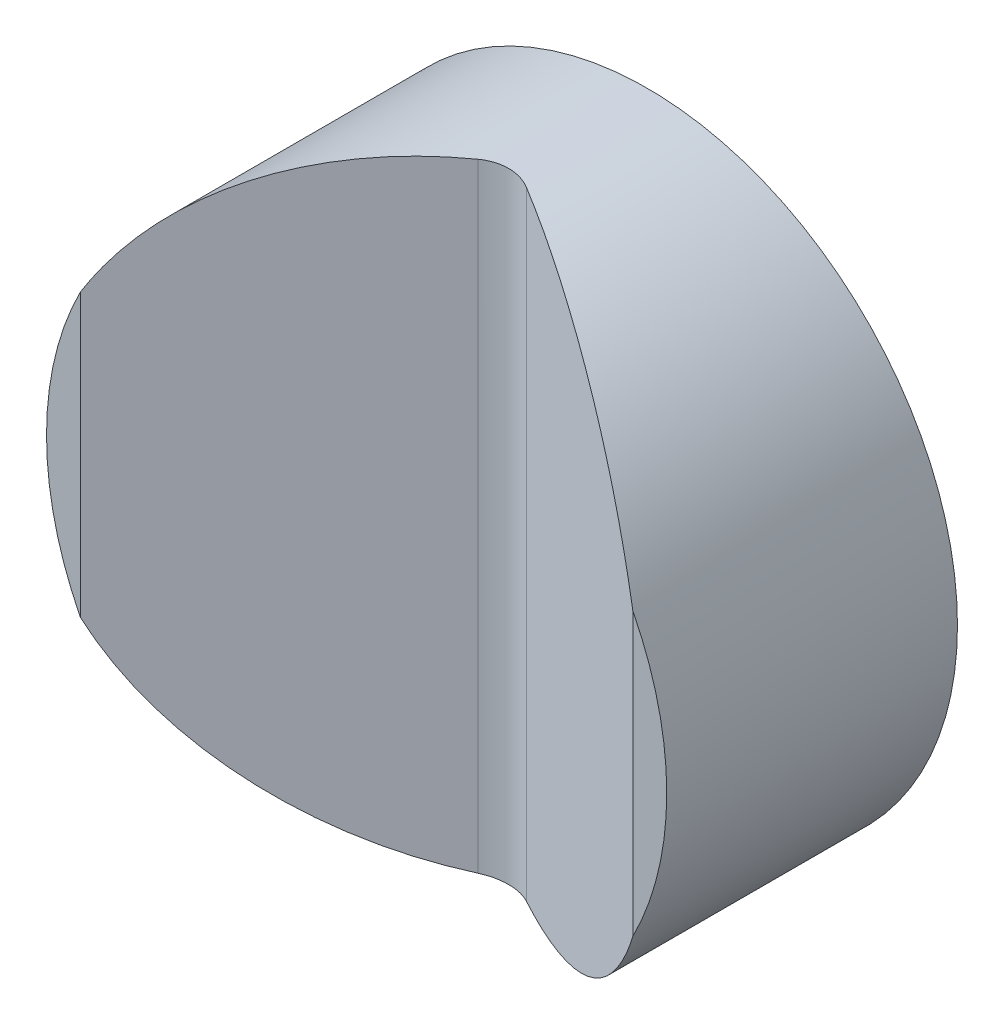
ISO-10303-21;
HEADER;
FILE_DESCRIPTION(('STEP AP214'),'2;1');
FILE_NAME('part.step','',(''),(''),'','','');
FILE_SCHEMA(('AUTOMOTIVE_DESIGN { 1 0 10303 214 1 1 1 1 }'));
ENDSEC;
DATA;
#1=APPLICATION_CONTEXT('core data for automotive mechanical design processes');
#2=APPLICATION_PROTOCOL_DEFINITION('international standard','automotive_design',2000,#1);
#3=PRODUCT_CONTEXT('',#1,'mechanical');
#4=PRODUCT('Part','Part','',(#3));
#5=PRODUCT_RELATED_PRODUCT_CATEGORY('part','',(#4));
#6=PRODUCT_DEFINITION_FORMATION('','',#4);
#7=PRODUCT_DEFINITION_CONTEXT('part definition',#1,'design');
#8=PRODUCT_DEFINITION('design','',#6,#7);
#9=PRODUCT_DEFINITION_SHAPE('','',#8);
#10=(LENGTH_UNIT() NAMED_UNIT(*) SI_UNIT(.MILLI.,.METRE.));
#11=(NAMED_UNIT(*) PLANE_ANGLE_UNIT() SI_UNIT($,.RADIAN.));
#12=(NAMED_UNIT(*) SI_UNIT($,.STERADIAN.) SOLID_ANGLE_UNIT());
#13=UNCERTAINTY_MEASURE_WITH_UNIT(LENGTH_MEASURE(1.E-05),#10,'distance_accuracy_value','');
#14=(GEOMETRIC_REPRESENTATION_CONTEXT(3) GLOBAL_UNCERTAINTY_ASSIGNED_CONTEXT((#13)) GLOBAL_UNIT_ASSIGNED_CONTEXT((#10,
#11,#12)) REPRESENTATION_CONTEXT('',''));
#15=CARTESIAN_POINT('',(0.,0.,0.));
#16=DIRECTION('',(0.,0.,1.));
#17=DIRECTION('',(1.,0.,0.));
#18=AXIS2_PLACEMENT_3D('',#15,#16,#17);
#19=CARTESIAN_POINT('',(0.,0.,-8.));
#20=DIRECTION('',(0.,0.,1.));
#21=DIRECTION('',(1.,0.,0.));
#22=AXIS2_PLACEMENT_3D('',#19,#20,#21);
#23=CYLINDRICAL_SURFACE('',#22,32.);
#24=CARTESIAN_POINT('',(0.,0.,0.));
#25=DIRECTION('',(0.,0.,1.));
#26=DIRECTION('',(1.,0.,0.));
#27=AXIS2_PLACEMENT_3D('',#24,#25,#26);
#28=CIRCLE('',#27,32.);
#29=CARTESIAN_POINT('',(32.,0.,0.));
#30=VERTEX_POINT('',#29);
#31=EDGE_CURVE('E99',#30,#30,#28,.T.);
#32=ORIENTED_EDGE('',*,*,#31,.T.);
#33=EDGE_LOOP('',(#32));
#34=FACE_BOUND('',#33,.T.);
#35=CARTESIAN_POINT('',(0.,0.,13.5455173280956));
#36=DIRECTION('',(0.500000000000001,0.,0.866025403784438));
#37=DIRECTION('',(-0.866025403784438,0.,0.500000000000001));
#38=AXIS2_PLACEMENT_3D('',#35,#36,#37);
#39=ELLIPSE('',#38,36.9504172281361,32.);
#40=CARTESIAN_POINT('',(-2.5,31.9021942818985,14.9888930010697));
#41=VERTEX_POINT('',#40);
#42=CARTESIAN_POINT('',(-28.5,14.5516322108552,30.));
#43=VERTEX_POINT('',#42);
#44=EDGE_CURVE('E63',#41,#43,#39,.T.);
#45=ORIENTED_EDGE('',*,*,#44,.F.);
#46=CARTESIAN_POINT('',(2.50000000000001,31.9021942818985,14.9888930010697));
#47=CARTESIAN_POINT('',(2.37929948328451,31.9116591797357,14.9191897750718));
#48=CARTESIAN_POINT('',(2.25564211743912,31.9206543995909,14.8545420297625));
#49=CARTESIAN_POINT('',(2.00329663766707,31.937480874513,14.7357667653459));
#50=CARTESIAN_POINT('',(1.87460847215003,31.9453121176394,14.6816393541576));
#51=CARTESIAN_POINT('',(1.61321161727601,31.9595790174653,14.5843618989657));
#52=CARTESIAN_POINT('',(1.48050688113463,31.9660159985935,14.541201430504));
#53=CARTESIAN_POINT('',(1.21189667290472,31.977325821359,14.4661084656949));
#54=CARTESIAN_POINT('',(1.07599130493891,31.9821987138039,14.4341756046289));
#55=CARTESIAN_POINT('',(0.801868095589281,31.990245698438,14.3817646559113));
#56=CARTESIAN_POINT('',(0.663649122924327,31.993418932946,14.3612923512491));
#57=CARTESIAN_POINT('',(0.385905002546045,31.997974520699,14.3319784033335));
#58=CARTESIAN_POINT('',(0.246379417350934,31.9993562508193,14.3231408068705));
#59=CARTESIAN_POINT('',(-0.0329474197205866,32.0002878636856,14.3171771534191));
#60=CARTESIAN_POINT('',(-0.17274870732112,31.9998374909871,14.3200527295623));
#61=CARTESIAN_POINT('',(-0.451602054607916,31.9971170156619,14.3374970355863));
#62=CARTESIAN_POINT('',(-0.590654114348016,31.9948469131659,14.352065764627));
#63=CARTESIAN_POINT('',(-0.866436618992349,31.9885641158581,14.392699442206));
#64=CARTESIAN_POINT('',(-1.00317430561327,31.9845586946766,14.4187164122187));
#65=CARTESIAN_POINT('',(-1.27390439939267,31.9749199818556,14.4820286966924));
#66=CARTESIAN_POINT('',(-1.40789776919601,31.9692872718808,14.519319981438));
#67=CARTESIAN_POINT('',(-1.67203670752157,31.9565604243654,14.604835276115));
#68=CARTESIAN_POINT('',(-1.80218797683149,31.9494685908434,14.653042061923));
#69=CARTESIAN_POINT('',(-2.05791388965449,31.934016079252,14.7600527967727));
#70=CARTESIAN_POINT('',(-2.1834913054819,31.9256561862051,14.8188501936379));
#71=CARTESIAN_POINT('',(-2.33902468414666,31.9144174466491,14.8997075588382));
#72=CARTESIAN_POINT('',(-2.37151589274141,31.9120190958785,14.9170579674994));
#73=CARTESIAN_POINT('',(-2.43607172178942,31.9071559327375,14.9524530435003));
#74=CARTESIAN_POINT('',(-2.46813672559983,31.9046911871184,14.9704970208084));
#75=CARTESIAN_POINT('',(-2.5,31.9021942818985,14.9888930010697));
#76=B_SPLINE_CURVE_WITH_KNOTS('',3,(#46,#47,#48,#49,#50,#51,#52,#53,#54,#55,#56,#57,#58,#59,#60,
#61,#62,#63,#64,#65,#66,#67,#68,#69,#70,#71,#72,#73,#74,#75),.UNSPECIFIED.,.F.,.F.,(4,2,2,2,2,2,
2,2,2,2,2,2,2,2,4),(0.,0.418985878034614,0.837976053858239,1.25656646250353,1.67514327235863,
2.09393110585774,2.51286456390987,2.93185643455761,3.35084827509677,3.76810063930735,
4.18520404329268,4.60165380945529,5.0178468068568,5.12857612436936,5.23919799252946),.UNSPECIFIED.);
#77=CARTESIAN_POINT('',(2.50000000000001,31.9021942818985,14.9888930010697));
#78=VERTEX_POINT('',#77);
#79=EDGE_CURVE('E11',#78,#41,#76,.T.);
#80=ORIENTED_EDGE('',*,*,#79,.F.);
#81=CARTESIAN_POINT('',(0.,0.,13.5455173280956));
#82=DIRECTION('',(-0.500000000000001,0.,0.866025403784438));
#83=DIRECTION('',(0.866025403784438,0.,0.500000000000001));
#84=AXIS2_PLACEMENT_3D('',#81,#82,#83);
#85=ELLIPSE('',#84,36.9504172281361,32.);
#86=CARTESIAN_POINT('',(28.5,14.5516322108552,30.));
#87=VERTEX_POINT('',#86);
#88=EDGE_CURVE('E82',#87,#78,#85,.T.);
#89=ORIENTED_EDGE('',*,*,#88,.F.);
#90=CARTESIAN_POINT('',(0.,0.,30.));
#91=DIRECTION('',(0.,0.,1.));
#92=DIRECTION('',(1.,0.,0.));
#93=AXIS2_PLACEMENT_3D('',#90,#91,#92);
#94=CIRCLE('',#93,32.);
#95=CARTESIAN_POINT('',(28.5,-14.5516322108552,30.));
#96=VERTEX_POINT('',#95);
#97=EDGE_CURVE('E92',#96,#87,#94,.T.);
#98=ORIENTED_EDGE('',*,*,#97,.F.);
#99=CARTESIAN_POINT('',(2.50000000000001,-31.9021942818985,14.9888930010697));
#100=VERTEX_POINT('',#99);
#101=EDGE_CURVE('E55',#100,#96,#85,.T.);
#102=ORIENTED_EDGE('',*,*,#101,.F.);
#103=CARTESIAN_POINT('',(-2.5,-31.9021942818985,14.9888930010697));
#104=CARTESIAN_POINT('',(-2.37929948328451,-31.9116591797357,14.9191897750718));
#105=CARTESIAN_POINT('',(-2.25564211743911,-31.9206543995909,14.8545420297625));
#106=CARTESIAN_POINT('',(-2.00329663766706,-31.937480874513,14.7357667653459));
#107=CARTESIAN_POINT('',(-1.87460847215002,-31.9453121176394,14.6816393541576));
#108=CARTESIAN_POINT('',(-1.613211617276,-31.9595790174653,14.5843618989657));
#109=CARTESIAN_POINT('',(-1.48050688113462,-31.9660159985935,14.541201430504));
#110=CARTESIAN_POINT('',(-1.21189667290472,-31.977325821359,14.4661084656949));
#111=CARTESIAN_POINT('',(-1.0759913049389,-31.9821987138039,14.4341756046289));
#112=CARTESIAN_POINT('',(-0.801868095589274,-31.990245698438,14.3817646559113));
#113=CARTESIAN_POINT('',(-0.66364912292432,-31.993418932946,14.3612923512491));
#114=CARTESIAN_POINT('',(-0.385905002546038,-31.997974520699,14.3319784033335));
#115=CARTESIAN_POINT('',(-0.246379417350927,-31.9993562508193,14.3231408068705));
#116=CARTESIAN_POINT('',(0.0329474197205939,-32.0002878636856,14.3171771534191));
#117=CARTESIAN_POINT('',(0.172748707321128,-31.9998374909871,14.3200527295623));
#118=CARTESIAN_POINT('',(0.451602054607923,-31.9971170156619,14.3374970355863));
#119=CARTESIAN_POINT('',(0.590654114348024,-31.9948469131659,14.352065764627));
#120=CARTESIAN_POINT('',(0.866436618992356,-31.9885641158581,14.392699442206));
#121=CARTESIAN_POINT('',(1.00317430561327,-31.9845586946766,14.4187164122187));
#122=CARTESIAN_POINT('',(1.27390439939267,-31.9749199818556,14.4820286966924));
#123=CARTESIAN_POINT('',(1.40789776919602,-31.9692872718808,14.519319981438));
#124=CARTESIAN_POINT('',(1.67203670752158,-31.9565604243654,14.604835276115));
#125=CARTESIAN_POINT('',(1.80218797683149,-31.9494685908434,14.653042061923));
#126=CARTESIAN_POINT('',(2.05791388965449,-31.934016079252,14.7600527967727));
#127=CARTESIAN_POINT('',(2.18349130548191,-31.9256561862051,14.8188501936379));
#128=CARTESIAN_POINT('',(2.33902468414667,-31.9144174466491,14.8997075588382));
#129=CARTESIAN_POINT('',(2.37151589274141,-31.9120190958785,14.9170579674994));
#130=CARTESIAN_POINT('',(2.43607172178943,-31.9071559327375,14.9524530435003));
#131=CARTESIAN_POINT('',(2.46813672559984,-31.9046911871184,14.9704970208084));
#132=CARTESIAN_POINT('',(2.50000000000001,-31.9021942818985,14.9888930010697));
#133=B_SPLINE_CURVE_WITH_KNOTS('',3,(#103,#104,#105,#106,#107,#108,#109,#110,#111,#112,#113,
#114,#115,#116,#117,#118,#119,#120,#121,#122,#123,#124,#125,#126,#127,#128,#129,#130,#131,#132),
.UNSPECIFIED.,.F.,.F.,(4,2,2,2,2,2,2,2,2,2,2,2,2,2,4),(0.,0.418985878034615,0.837976053858239,
1.25656646250353,1.67514327235863,2.09393110585774,2.51286456390987,2.93185643455761,
3.35084827509677,3.76810063930735,4.18520404329268,4.60165380945529,5.0178468068568,
5.12857612436936,5.23919799252946),.UNSPECIFIED.);
#134=CARTESIAN_POINT('',(-2.5,-31.9021942818985,14.9888930010697));
#135=VERTEX_POINT('',#134);
#136=EDGE_CURVE('E48',#135,#100,#133,.T.);
#137=ORIENTED_EDGE('',*,*,#136,.F.);
#138=CARTESIAN_POINT('',(-28.5,-14.5516322108552,30.));
#139=VERTEX_POINT('',#138);
#140=EDGE_CURVE('E96',#139,#135,#39,.T.);
#141=ORIENTED_EDGE('',*,*,#140,.F.);
#142=EDGE_CURVE('E95',#43,#139,#94,.T.);
#143=ORIENTED_EDGE('',*,*,#142,.F.);
#144=EDGE_LOOP('',(#45,#80,#89,#98,#102,#137,#141,#143));
#145=FACE_BOUND('',#144,.T.);
#146=ADVANCED_FACE('F35',(#34,#145),#23,.T.);
#147=CARTESIAN_POINT('',(0.,32.,30.));
#148=DIRECTION('',(0.,0.,-1.));
#149=DIRECTION('',(-1.,0.,0.));
#150=AXIS2_PLACEMENT_3D('',#147,#148,#149);
#151=PLANE('',#150);
#152=DIRECTION('',(0.,-1.,0.));
#153=VECTOR('',#152,1.);
#154=CARTESIAN_POINT('',(-28.5,32.,30.));
#155=LINE('',#154,#153);
#156=EDGE_CURVE('E87',#43,#139,#155,.T.);
#157=ORIENTED_EDGE('',*,*,#156,.F.);
#158=ORIENTED_EDGE('',*,*,#142,.T.);
#159=EDGE_LOOP('',(#157,#158));
#160=FACE_BOUND('',#159,.T.);
#161=ADVANCED_FACE('F125',(#160),#151,.F.);
#162=DIRECTION('',(0.,1.,0.));
#163=VECTOR('',#162,1.);
#164=CARTESIAN_POINT('',(28.5,32.,30.));
#165=LINE('',#164,#163);
#166=EDGE_CURVE('E79',#96,#87,#165,.T.);
#167=ORIENTED_EDGE('',*,*,#166,.F.);
#168=ORIENTED_EDGE('',*,*,#97,.T.);
#169=EDGE_LOOP('',(#167,#168));
#170=FACE_BOUND('',#169,.T.);
#171=ADVANCED_FACE('F94',(#170),#151,.F.);
#172=CARTESIAN_POINT('',(0.,0.,-8.));
#173=DIRECTION('',(0.,0.,1.));
#174=DIRECTION('',(1.,0.,0.));
#175=AXIS2_PLACEMENT_3D('',#172,#173,#174);
#176=PLANE('',#175);
#177=CARTESIAN_POINT('',(0.,0.,-8.));
#178=DIRECTION('',(0.,0.,1.));
#179=DIRECTION('',(1.,0.,0.));
#180=AXIS2_PLACEMENT_3D('',#177,#178,#179);
#181=CIRCLE('',#180,6.);
#182=CARTESIAN_POINT('',(6.,0.,-8.));
#183=VERTEX_POINT('',#182);
#184=EDGE_CURVE('E88',#183,#183,#181,.T.);
#185=ORIENTED_EDGE('',*,*,#184,.F.);
#186=EDGE_LOOP('',(#185));
#187=FACE_BOUND('',#186,.T.);
#188=ADVANCED_FACE('F37',(#187),#176,.F.);
#189=CARTESIAN_POINT('',(0.,0.,-8.));
#190=DIRECTION('',(0.,0.,1.));
#191=DIRECTION('',(1.,0.,0.));
#192=AXIS2_PLACEMENT_3D('',#189,#190,#191);
#193=CYLINDRICAL_SURFACE('',#192,6.);
#194=CARTESIAN_POINT('',(0.,0.,0.));
#195=DIRECTION('',(0.,0.,1.));
#196=DIRECTION('',(1.,0.,0.));
#197=AXIS2_PLACEMENT_3D('',#194,#195,#196);
#198=CIRCLE('',#197,6.);
#199=CARTESIAN_POINT('',(6.,0.,0.));
#200=VERTEX_POINT('',#199);
#201=EDGE_CURVE('E104',#200,#200,#198,.T.);
#202=ORIENTED_EDGE('',*,*,#201,.F.);
#203=EDGE_LOOP('',(#202));
#204=FACE_BOUND('',#203,.T.);
#205=ORIENTED_EDGE('',*,*,#184,.T.);
#206=EDGE_LOOP('',(#205));
#207=FACE_BOUND('',#206,.T.);
#208=ADVANCED_FACE('F147',(#204,#207),#193,.T.);
#209=CARTESIAN_POINT('',(0.,6.,0.));
#210=DIRECTION('',(0.,0.,1.));
#211=DIRECTION('',(1.,0.,0.));
#212=AXIS2_PLACEMENT_3D('',#209,#210,#211);
#213=PLANE('',#212);
#214=ORIENTED_EDGE('',*,*,#31,.F.);
#215=EDGE_LOOP('',(#214));
#216=FACE_BOUND('',#215,.T.);
#217=ORIENTED_EDGE('',*,*,#201,.T.);
#218=EDGE_LOOP('',(#217));
#219=FACE_BOUND('',#218,.T.);
#220=ADVANCED_FACE('F121',(#216,#219),#213,.F.);
#221=CARTESIAN_POINT('',(0.,-35.,19.3190200199919));
#222=DIRECTION('',(0.,1.,0.));
#223=DIRECTION('',(0.,0.,1.));
#224=AXIS2_PLACEMENT_3D('',#221,#222,#223);
#225=CYLINDRICAL_SURFACE('',#224,5.);
#226=ORIENTED_EDGE('',*,*,#136,.T.);
#227=DIRECTION('',(0.,1.,0.));
#228=VECTOR('',#227,1.);
#229=CARTESIAN_POINT('',(2.50000000000001,-35.,14.9888930010697));
#230=LINE('',#229,#228);
#231=EDGE_CURVE('E138',#100,#78,#230,.T.);
#232=ORIENTED_EDGE('',*,*,#231,.T.);
#233=ORIENTED_EDGE('',*,*,#79,.T.);
#234=DIRECTION('',(0.,1.,0.));
#235=VECTOR('',#234,1.);
#236=CARTESIAN_POINT('',(-2.5,-35.,14.9888930010697));
#237=LINE('',#236,#235);
#238=EDGE_CURVE('E137',#135,#41,#237,.T.);
#239=ORIENTED_EDGE('',*,*,#238,.F.);
#240=EDGE_LOOP('',(#226,#232,#233,#239));
#241=FACE_BOUND('',#240,.T.);
#242=ADVANCED_FACE('F115',(#241),#225,.F.);
#243=CARTESIAN_POINT('',(-28.5,-35.,30.));
#244=DIRECTION('',(0.500000000000001,0.,0.866025403784438));
#245=DIRECTION('',(0.866025403784438,0.,-0.500000000000001));
#246=AXIS2_PLACEMENT_3D('',#243,#244,#245);
#247=PLANE('',#246);
#248=ORIENTED_EDGE('',*,*,#140,.T.);
#249=ORIENTED_EDGE('',*,*,#238,.T.);
#250=ORIENTED_EDGE('',*,*,#44,.T.);
#251=ORIENTED_EDGE('',*,*,#156,.T.);
#252=EDGE_LOOP('',(#248,#249,#250,#251));
#253=FACE_BOUND('',#252,.T.);
#254=ADVANCED_FACE('F120',(#253),#247,.T.);
#255=CARTESIAN_POINT('',(2.50000000000001,-35.,14.9888930010697));
#256=DIRECTION('',(-0.500000000000001,0.,0.866025403784438));
#257=DIRECTION('',(0.866025403784438,0.,0.500000000000001));
#258=AXIS2_PLACEMENT_3D('',#255,#256,#257);
#259=PLANE('',#258);
#260=ORIENTED_EDGE('',*,*,#88,.T.);
#261=ORIENTED_EDGE('',*,*,#231,.F.);
#262=ORIENTED_EDGE('',*,*,#101,.T.);
#263=ORIENTED_EDGE('',*,*,#166,.T.);
#264=EDGE_LOOP('',(#260,#261,#262,#263));
#265=FACE_BOUND('',#264,.T.);
#266=ADVANCED_FACE('F81',(#265),#259,.T.);
#267=CLOSED_SHELL('',(#146,#161,#171,#188,#208,#220,#242,#254,#266));
#268=MANIFOLD_SOLID_BREP('B2',#267);
#269=ADVANCED_BREP_SHAPE_REPRESENTATION('',(#18,#268),#14);
#270=SHAPE_DEFINITION_REPRESENTATION(#9,#269);
ENDSEC;
END-ISO-10303-21;
